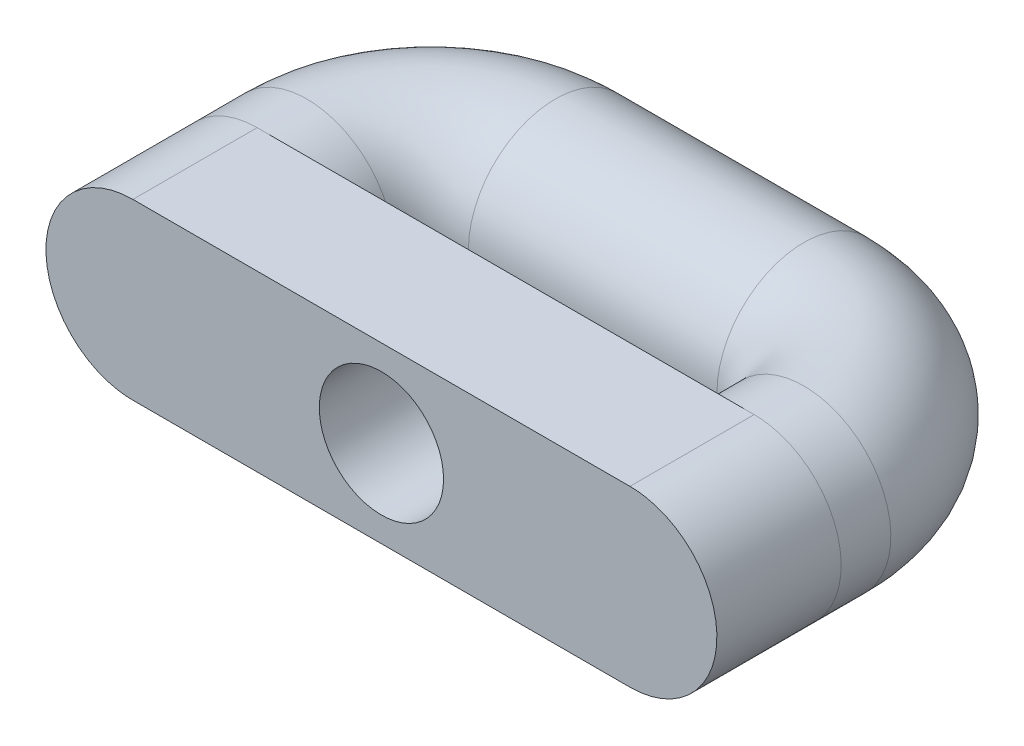
ISO-10303-21;
HEADER;
FILE_DESCRIPTION(('STEP AP214'),'2;1');
FILE_NAME('part.step','',(''),(''),'','','');
FILE_SCHEMA(('AUTOMOTIVE_DESIGN { 1 0 10303 214 1 1 1 1 }'));
ENDSEC;
DATA;
#1=APPLICATION_CONTEXT('core data for automotive mechanical design processes');
#2=APPLICATION_PROTOCOL_DEFINITION('international standard','automotive_design',2000,#1);
#3=PRODUCT_CONTEXT('',#1,'mechanical');
#4=PRODUCT('Part','Part','',(#3));
#5=PRODUCT_RELATED_PRODUCT_CATEGORY('part','',(#4));
#6=PRODUCT_DEFINITION_FORMATION('','',#4);
#7=PRODUCT_DEFINITION_CONTEXT('part definition',#1,'design');
#8=PRODUCT_DEFINITION('design','',#6,#7);
#9=PRODUCT_DEFINITION_SHAPE('','',#8);
#10=(LENGTH_UNIT() NAMED_UNIT(*) SI_UNIT(.MILLI.,.METRE.));
#11=(NAMED_UNIT(*) PLANE_ANGLE_UNIT() SI_UNIT($,.RADIAN.));
#12=(NAMED_UNIT(*) SI_UNIT($,.STERADIAN.) SOLID_ANGLE_UNIT());
#13=UNCERTAINTY_MEASURE_WITH_UNIT(LENGTH_MEASURE(1.E-05),#10,'distance_accuracy_value','');
#14=(GEOMETRIC_REPRESENTATION_CONTEXT(3) GLOBAL_UNCERTAINTY_ASSIGNED_CONTEXT((#13)) GLOBAL_UNIT_ASSIGNED_CONTEXT((#10,
#11,#12)) REPRESENTATION_CONTEXT('',''));
#15=CARTESIAN_POINT('',(0.,0.,0.));
#16=DIRECTION('',(0.,0.,1.));
#17=DIRECTION('',(1.,0.,0.));
#18=AXIS2_PLACEMENT_3D('',#15,#16,#17);
#19=CARTESIAN_POINT('',(0.,0.,0.));
#20=DIRECTION('',(0.,0.,1.));
#21=DIRECTION('',(1.,0.,0.));
#22=AXIS2_PLACEMENT_3D('',#19,#20,#21);
#23=PLANE('',#22);
#24=CARTESIAN_POINT('',(12.7,0.,0.));
#25=DIRECTION('',(0.,0.,1.));
#26=DIRECTION('',(1.,0.,0.));
#27=AXIS2_PLACEMENT_3D('',#24,#25,#26);
#28=CIRCLE('',#27,3.175);
#29=CARTESIAN_POINT('',(15.875,0.,0.));
#30=VERTEX_POINT('',#29);
#31=EDGE_CURVE('E135',#30,#30,#28,.F.);
#32=ORIENTED_EDGE('',*,*,#31,.F.);
#33=EDGE_LOOP('',(#32));
#34=FACE_BOUND('',#33,.T.);
#35=CARTESIAN_POINT('',(0.,0.,0.));
#36=DIRECTION('',(0.,0.,-1.));
#37=DIRECTION('',(0.,-1.,0.));
#38=AXIS2_PLACEMENT_3D('',#35,#36,#37);
#39=ELLIPSE('',#38,4.445,4.445);
#40=CARTESIAN_POINT('',(0.,4.445,0.));
#41=VERTEX_POINT('',#40);
#42=CARTESIAN_POINT('',(0.,-4.445,0.));
#43=VERTEX_POINT('',#42);
#44=EDGE_CURVE('E11',#41,#43,#39,.T.);
#45=ORIENTED_EDGE('',*,*,#44,.F.);
#46=DIRECTION('',(1.,0.,0.));
#47=VECTOR('',#46,1.);
#48=CARTESIAN_POINT('',(0.,4.445,0.));
#49=LINE('',#48,#47);
#50=CARTESIAN_POINT('',(25.4,4.445,0.));
#51=VERTEX_POINT('',#50);
#52=EDGE_CURVE('E136',#41,#51,#49,.T.);
#53=ORIENTED_EDGE('',*,*,#52,.T.);
#54=CARTESIAN_POINT('',(25.4,0.,0.));
#55=DIRECTION('',(0.,0.,1.));
#56=DIRECTION('',(1.,0.,0.));
#57=AXIS2_PLACEMENT_3D('',#54,#55,#56);
#58=CIRCLE('',#57,4.445);
#59=CARTESIAN_POINT('',(25.4,-4.445,0.));
#60=VERTEX_POINT('',#59);
#61=EDGE_CURVE('E21',#51,#60,#58,.T.);
#62=ORIENTED_EDGE('',*,*,#61,.T.);
#63=DIRECTION('',(1.,0.,0.));
#64=VECTOR('',#63,1.);
#65=CARTESIAN_POINT('',(0.,-4.445,0.));
#66=LINE('',#65,#64);
#67=EDGE_CURVE('E70',#43,#60,#66,.T.);
#68=ORIENTED_EDGE('',*,*,#67,.F.);
#69=EDGE_LOOP('',(#45,#53,#62,#68));
#70=FACE_BOUND('',#69,.T.);
#71=ADVANCED_FACE('F17',(#34,#70),#23,.F.);
#72=CARTESIAN_POINT('',(0.,-4.445,6.35));
#73=DIRECTION('',(0.,1.,0.));
#74=DIRECTION('',(0.,0.,1.));
#75=AXIS2_PLACEMENT_3D('',#72,#73,#74);
#76=PLANE('',#75);
#77=ORIENTED_EDGE('',*,*,#67,.T.);
#78=DIRECTION('',(0.,0.,-1.));
#79=VECTOR('',#78,1.);
#80=CARTESIAN_POINT('',(25.4,-4.445,6.35));
#81=LINE('',#80,#79);
#82=CARTESIAN_POINT('',(25.4,-4.445,6.35));
#83=VERTEX_POINT('',#82);
#84=EDGE_CURVE('E95',#83,#60,#81,.T.);
#85=ORIENTED_EDGE('',*,*,#84,.F.);
#86=DIRECTION('',(1.,0.,0.));
#87=VECTOR('',#86,1.);
#88=CARTESIAN_POINT('',(0.,-4.445,6.35));
#89=LINE('',#88,#87);
#90=CARTESIAN_POINT('',(0.,-4.445,6.35));
#91=VERTEX_POINT('',#90);
#92=EDGE_CURVE('E84',#91,#83,#89,.T.);
#93=ORIENTED_EDGE('',*,*,#92,.F.);
#94=DIRECTION('',(0.,0.,-1.));
#95=VECTOR('',#94,1.);
#96=CARTESIAN_POINT('',(0.,-4.445,6.35));
#97=LINE('',#96,#95);
#98=EDGE_CURVE('E108',#91,#43,#97,.T.);
#99=ORIENTED_EDGE('',*,*,#98,.T.);
#100=EDGE_LOOP('',(#77,#85,#93,#99));
#101=FACE_BOUND('',#100,.T.);
#102=ADVANCED_FACE('F19',(#101),#76,.F.);
#103=CARTESIAN_POINT('',(25.4,0.,6.35));
#104=DIRECTION('',(0.,0.,1.));
#105=DIRECTION('',(0.,-1.,0.));
#106=AXIS2_PLACEMENT_3D('',#103,#104,#105);
#107=ELLIPSE('',#106,4.445,4.445);
#108=DIRECTION('',(0.,0.,-1.));
#109=VECTOR('',#108,1.);
#110=SURFACE_OF_LINEAR_EXTRUSION('',#107,#109);
#111=ORIENTED_EDGE('',*,*,#84,.T.);
#112=CARTESIAN_POINT('',(25.4,0.,0.));
#113=DIRECTION('',(0.,0.,1.));
#114=DIRECTION('',(0.,-1.,0.));
#115=AXIS2_PLACEMENT_3D('',#112,#113,#114);
#116=ELLIPSE('',#115,4.445,4.445);
#117=EDGE_CURVE('E92',#60,#51,#116,.T.);
#118=ORIENTED_EDGE('',*,*,#117,.T.);
#119=DIRECTION('',(0.,0.,-1.));
#120=VECTOR('',#119,1.);
#121=CARTESIAN_POINT('',(25.4,4.445,6.35));
#122=LINE('',#121,#120);
#123=CARTESIAN_POINT('',(25.4,4.445,6.35));
#124=VERTEX_POINT('',#123);
#125=EDGE_CURVE('E58',#124,#51,#122,.T.);
#126=ORIENTED_EDGE('',*,*,#125,.F.);
#127=EDGE_CURVE('E80',#83,#124,#107,.T.);
#128=ORIENTED_EDGE('',*,*,#127,.F.);
#129=EDGE_LOOP('',(#111,#118,#126,#128));
#130=FACE_BOUND('',#129,.T.);
#131=ADVANCED_FACE('F90',(#130),#110,.F.);
#132=CARTESIAN_POINT('',(0.,4.445,6.35));
#133=DIRECTION('',(0.,1.,0.));
#134=DIRECTION('',(0.,0.,1.));
#135=AXIS2_PLACEMENT_3D('',#132,#133,#134);
#136=PLANE('',#135);
#137=ORIENTED_EDGE('',*,*,#52,.F.);
#138=DIRECTION('',(0.,0.,-1.));
#139=VECTOR('',#138,1.);
#140=CARTESIAN_POINT('',(0.,4.445,6.35));
#141=LINE('',#140,#139);
#142=CARTESIAN_POINT('',(0.,4.445,6.35));
#143=VERTEX_POINT('',#142);
#144=EDGE_CURVE('E96',#143,#41,#141,.T.);
#145=ORIENTED_EDGE('',*,*,#144,.F.);
#146=DIRECTION('',(1.,0.,0.));
#147=VECTOR('',#146,1.);
#148=CARTESIAN_POINT('',(0.,4.445,6.35));
#149=LINE('',#148,#147);
#150=EDGE_CURVE('E82',#143,#124,#149,.T.);
#151=ORIENTED_EDGE('',*,*,#150,.T.);
#152=ORIENTED_EDGE('',*,*,#125,.T.);
#153=EDGE_LOOP('',(#137,#145,#151,#152));
#154=FACE_BOUND('',#153,.T.);
#155=ADVANCED_FACE('F98',(#154),#136,.T.);
#156=CARTESIAN_POINT('',(0.,0.,6.35));
#157=DIRECTION('',(0.,0.,1.));
#158=DIRECTION('',(0.,-1.,0.));
#159=AXIS2_PLACEMENT_3D('',#156,#157,#158);
#160=ELLIPSE('',#159,4.445,4.445);
#161=DIRECTION('',(0.,0.,-1.));
#162=VECTOR('',#161,1.);
#163=SURFACE_OF_LINEAR_EXTRUSION('',#160,#162);
#164=CARTESIAN_POINT('',(0.,0.,0.));
#165=DIRECTION('',(0.,0.,1.));
#166=DIRECTION('',(0.,-1.,0.));
#167=AXIS2_PLACEMENT_3D('',#164,#165,#166);
#168=ELLIPSE('',#167,4.445,4.445);
#169=EDGE_CURVE('E140',#41,#43,#168,.T.);
#170=ORIENTED_EDGE('',*,*,#169,.T.);
#171=ORIENTED_EDGE('',*,*,#98,.F.);
#172=EDGE_CURVE('E41',#143,#91,#160,.T.);
#173=ORIENTED_EDGE('',*,*,#172,.F.);
#174=ORIENTED_EDGE('',*,*,#144,.T.);
#175=EDGE_LOOP('',(#170,#171,#173,#174));
#176=FACE_BOUND('',#175,.T.);
#177=ADVANCED_FACE('F116',(#176),#163,.F.);
#178=CARTESIAN_POINT('',(0.,0.,6.35));
#179=DIRECTION('',(0.,0.,1.));
#180=DIRECTION('',(1.,0.,0.));
#181=AXIS2_PLACEMENT_3D('',#178,#179,#180);
#182=PLANE('',#181);
#183=CARTESIAN_POINT('',(12.7,0.,6.35));
#184=DIRECTION('',(0.,0.,1.));
#185=DIRECTION('',(1.,0.,0.));
#186=AXIS2_PLACEMENT_3D('',#183,#184,#185);
#187=CIRCLE('',#186,3.175);
#188=CARTESIAN_POINT('',(15.875,0.,6.35));
#189=VERTEX_POINT('',#188);
#190=EDGE_CURVE('E184',#189,#189,#187,.T.);
#191=ORIENTED_EDGE('',*,*,#190,.F.);
#192=EDGE_LOOP('',(#191));
#193=FACE_BOUND('',#192,.T.);
#194=ORIENTED_EDGE('',*,*,#92,.T.);
#195=ORIENTED_EDGE('',*,*,#127,.T.);
#196=ORIENTED_EDGE('',*,*,#150,.F.);
#197=ORIENTED_EDGE('',*,*,#172,.T.);
#198=EDGE_LOOP('',(#194,#195,#196,#197));
#199=FACE_BOUND('',#198,.T.);
#200=ADVANCED_FACE('F81',(#193,#199),#182,.T.);
#201=CARTESIAN_POINT('',(25.4,0.,-2.54));
#202=DIRECTION('',(0.,0.,1.));
#203=DIRECTION('',(1.,0.,0.));
#204=AXIS2_PLACEMENT_3D('',#201,#202,#203);
#205=CYLINDRICAL_SURFACE('',#204,4.445);
#206=CARTESIAN_POINT('',(25.4,0.,-2.54));
#207=DIRECTION('',(0.,0.,1.));
#208=DIRECTION('',(0.,-1.,0.));
#209=AXIS2_PLACEMENT_3D('',#206,#207,#208);
#210=ELLIPSE('',#209,4.445,4.445);
#211=CARTESIAN_POINT('',(25.4,-4.445,-2.54));
#212=VERTEX_POINT('',#211);
#213=EDGE_CURVE('E163',#212,#212,#210,.T.);
#214=ORIENTED_EDGE('',*,*,#213,.T.);
#215=EDGE_LOOP('',(#214));
#216=FACE_BOUND('',#215,.T.);
#217=ORIENTED_EDGE('',*,*,#61,.F.);
#218=ORIENTED_EDGE('',*,*,#117,.F.);
#219=EDGE_LOOP('',(#217,#218));
#220=FACE_BOUND('',#219,.T.);
#221=ADVANCED_FACE('F201',(#216,#220),#205,.T.);
#222=CARTESIAN_POINT('',(0.,0.,0.));
#223=DIRECTION('',(0.,0.,-1.));
#224=DIRECTION('',(-1.,0.,0.));
#225=AXIS2_PLACEMENT_3D('',#222,#223,#224);
#226=CYLINDRICAL_SURFACE('',#225,4.445);
#227=CARTESIAN_POINT('',(0.,0.,-2.53999999999995));
#228=DIRECTION('',(0.,0.,-1.));
#229=DIRECTION('',(0.,-1.,0.));
#230=AXIS2_PLACEMENT_3D('',#227,#228,#229);
#231=ELLIPSE('',#230,4.445,4.445);
#232=CARTESIAN_POINT('',(0.,-4.445,-2.53999999999995));
#233=VERTEX_POINT('',#232);
#234=EDGE_CURVE('E181',#233,#233,#231,.T.);
#235=ORIENTED_EDGE('',*,*,#234,.F.);
#236=EDGE_LOOP('',(#235));
#237=FACE_BOUND('',#236,.T.);
#238=ORIENTED_EDGE('',*,*,#169,.F.);
#239=ORIENTED_EDGE('',*,*,#44,.T.);
#240=EDGE_LOOP('',(#238,#239));
#241=FACE_BOUND('',#240,.T.);
#242=ADVANCED_FACE('F145',(#237,#241),#226,.T.);
#243=CARTESIAN_POINT('',(6.35,0.,-2.54));
#244=DIRECTION('',(0.,-1.,0.));
#245=DIRECTION('',(0.,0.,-1.));
#246=AXIS2_PLACEMENT_3D('',#243,#244,#245);
#247=TOROIDAL_SURFACE('',#246,6.35,4.445);
#248=CARTESIAN_POINT('',(6.35,0.,-8.89));
#249=DIRECTION('',(1.,0.,0.));
#250=DIRECTION('',(0.,-1.,0.));
#251=AXIS2_PLACEMENT_3D('',#248,#249,#250);
#252=ELLIPSE('',#251,4.445,4.445);
#253=CARTESIAN_POINT('',(6.35,-4.445,-8.89));
#254=VERTEX_POINT('',#253);
#255=EDGE_CURVE('E176',#254,#254,#252,.T.);
#256=ORIENTED_EDGE('',*,*,#255,.F.);
#257=EDGE_LOOP('',(#256));
#258=FACE_BOUND('',#257,.T.);
#259=ORIENTED_EDGE('',*,*,#234,.T.);
#260=EDGE_LOOP('',(#259));
#261=FACE_BOUND('',#260,.T.);
#262=ADVANCED_FACE('F213',(#258,#261),#247,.T.);
#263=CARTESIAN_POINT('',(6.35,0.,-8.89));
#264=DIRECTION('',(1.,0.,0.));
#265=DIRECTION('',(0.,0.,-1.));
#266=AXIS2_PLACEMENT_3D('',#263,#264,#265);
#267=CYLINDRICAL_SURFACE('',#266,4.445);
#268=CARTESIAN_POINT('',(19.05,0.,-8.89));
#269=DIRECTION('',(1.,0.,0.));
#270=DIRECTION('',(0.,-1.,0.));
#271=AXIS2_PLACEMENT_3D('',#268,#269,#270);
#272=ELLIPSE('',#271,4.445,4.445);
#273=CARTESIAN_POINT('',(19.05,-4.445,-8.89));
#274=VERTEX_POINT('',#273);
#275=EDGE_CURVE('E168',#274,#274,#272,.T.);
#276=ORIENTED_EDGE('',*,*,#275,.F.);
#277=EDGE_LOOP('',(#276));
#278=FACE_BOUND('',#277,.T.);
#279=ORIENTED_EDGE('',*,*,#255,.T.);
#280=EDGE_LOOP('',(#279));
#281=FACE_BOUND('',#280,.T.);
#282=ADVANCED_FACE('F209',(#278,#281),#267,.T.);
#283=CARTESIAN_POINT('',(19.05,0.,-2.54));
#284=DIRECTION('',(0.,-1.,0.));
#285=DIRECTION('',(0.,0.,-1.));
#286=AXIS2_PLACEMENT_3D('',#283,#284,#285);
#287=TOROIDAL_SURFACE('',#286,6.35,4.445);
#288=ORIENTED_EDGE('',*,*,#213,.F.);
#289=EDGE_LOOP('',(#288));
#290=FACE_BOUND('',#289,.T.);
#291=ORIENTED_EDGE('',*,*,#275,.T.);
#292=EDGE_LOOP('',(#291));
#293=FACE_BOUND('',#292,.T.);
#294=ADVANCED_FACE('F196',(#290,#293),#287,.T.);
#295=CARTESIAN_POINT('',(12.7,0.,-8.98025612106916));
#296=DIRECTION('',(0.,0.,1.));
#297=DIRECTION('',(1.,0.,0.));
#298=AXIS2_PLACEMENT_3D('',#295,#296,#297);
#299=CYLINDRICAL_SURFACE('',#298,3.175);
#300=CARTESIAN_POINT('',(15.875,0.,0.));
#301=CARTESIAN_POINT('',(15.875,0.,0.0661458333333318));
#302=CARTESIAN_POINT('',(15.875,0.,0.132291666666665));
#303=CARTESIAN_POINT('',(15.875,0.,0.264583333333332));
#304=CARTESIAN_POINT('',(15.875,0.,0.330729166666665));
#305=CARTESIAN_POINT('',(15.875,0.,0.463020833333331));
#306=CARTESIAN_POINT('',(15.875,0.,0.529166666666665));
#307=CARTESIAN_POINT('',(15.875,0.,0.661458333333332));
#308=CARTESIAN_POINT('',(15.875,0.,0.727604166666665));
#309=CARTESIAN_POINT('',(15.875,0.,0.859895833333331));
#310=CARTESIAN_POINT('',(15.875,0.,0.926041666666665));
#311=CARTESIAN_POINT('',(15.875,0.,1.05833333333333));
#312=CARTESIAN_POINT('',(15.875,0.,1.12447916666667));
#313=CARTESIAN_POINT('',(15.875,0.,1.25677083333333));
#314=CARTESIAN_POINT('',(15.875,0.,1.32291666666666));
#315=CARTESIAN_POINT('',(15.875,0.,1.45520833333333));
#316=CARTESIAN_POINT('',(15.875,0.,1.52135416666667));
#317=CARTESIAN_POINT('',(15.875,0.,1.65364583333333));
#318=CARTESIAN_POINT('',(15.875,0.,1.71979166666667));
#319=CARTESIAN_POINT('',(15.875,0.,1.85208333333333));
#320=CARTESIAN_POINT('',(15.875,0.,1.91822916666667));
#321=CARTESIAN_POINT('',(15.875,0.,2.05052083333333));
#322=CARTESIAN_POINT('',(15.875,0.,2.11666666666667));
#323=CARTESIAN_POINT('',(15.875,0.,2.24895833333333));
#324=CARTESIAN_POINT('',(15.875,0.,2.31510416666667));
#325=CARTESIAN_POINT('',(15.875,0.,2.44739583333333));
#326=CARTESIAN_POINT('',(15.875,0.,2.51354166666667));
#327=CARTESIAN_POINT('',(15.875,0.,2.64583333333333));
#328=CARTESIAN_POINT('',(15.875,0.,2.71197916666667));
#329=CARTESIAN_POINT('',(15.875,0.,2.84427083333333));
#330=CARTESIAN_POINT('',(15.875,0.,2.91041666666667));
#331=CARTESIAN_POINT('',(15.875,0.,3.04270833333333));
#332=CARTESIAN_POINT('',(15.875,0.,3.10885416666667));
#333=CARTESIAN_POINT('',(15.875,0.,3.24114583333333));
#334=CARTESIAN_POINT('',(15.875,0.,3.30729166666667));
#335=CARTESIAN_POINT('',(15.875,0.,3.43958333333333));
#336=CARTESIAN_POINT('',(15.875,0.,3.50572916666667));
#337=CARTESIAN_POINT('',(15.875,0.,3.63802083333333));
#338=CARTESIAN_POINT('',(15.875,0.,3.70416666666667));
#339=CARTESIAN_POINT('',(15.875,0.,3.83645833333333));
#340=CARTESIAN_POINT('',(15.875,0.,3.90260416666667));
#341=CARTESIAN_POINT('',(15.875,0.,4.03489583333333));
#342=CARTESIAN_POINT('',(15.875,0.,4.10104166666667));
#343=CARTESIAN_POINT('',(15.875,0.,4.23333333333333));
#344=CARTESIAN_POINT('',(15.875,0.,4.29947916666667));
#345=CARTESIAN_POINT('',(15.875,0.,4.43177083333333));
#346=CARTESIAN_POINT('',(15.875,0.,4.49791666666667));
#347=CARTESIAN_POINT('',(15.875,0.,4.63020833333333));
#348=CARTESIAN_POINT('',(15.875,0.,4.69635416666667));
#349=CARTESIAN_POINT('',(15.875,0.,4.82864583333333));
#350=CARTESIAN_POINT('',(15.875,0.,4.89479166666667));
#351=CARTESIAN_POINT('',(15.875,0.,5.02708333333333));
#352=CARTESIAN_POINT('',(15.875,0.,5.09322916666667));
#353=CARTESIAN_POINT('',(15.875,0.,5.22552083333333));
#354=CARTESIAN_POINT('',(15.875,0.,5.29166666666667));
#355=CARTESIAN_POINT('',(15.875,0.,5.42395833333333));
#356=CARTESIAN_POINT('',(15.875,0.,5.49010416666667));
#357=CARTESIAN_POINT('',(15.875,0.,5.62239583333333));
#358=CARTESIAN_POINT('',(15.875,0.,5.68854166666667));
#359=CARTESIAN_POINT('',(15.875,0.,5.82083333333333));
#360=CARTESIAN_POINT('',(15.875,0.,5.88697916666667));
#361=CARTESIAN_POINT('',(15.875,0.,6.01927083333333));
#362=CARTESIAN_POINT('',(15.875,0.,6.08541666666667));
#363=CARTESIAN_POINT('',(15.875,0.,6.21770833333333));
#364=CARTESIAN_POINT('',(15.875,0.,6.28385416666667));
#365=CARTESIAN_POINT('',(15.875,0.,6.35));
#366=B_SPLINE_CURVE_WITH_KNOTS('',3,(#300,#301,#302,#303,#304,#305,#306,#307,#308,#309,#310,
#311,#312,#313,#314,#315,#316,#317,#318,#319,#320,#321,#322,#323,#324,#325,#326,#327,#328,#329,
#330,#331,#332,#333,#334,#335,#336,#337,#338,#339,#340,#341,#342,#343,#344,#345,#346,#347,#348,
#349,#350,#351,#352,#353,#354,#355,#356,#357,#358,#359,#360,#361,#362,#363,#364,#365),
.UNSPECIFIED.,.F.,.F.,(4,2,2,2,2,2,2,2,2,2,2,2,2,2,2,2,2,2,2,2,2,2,2,2,2,2,2,2,2,2,2,2,4),(0.,
0.198437500000001,0.396875,0.5953125,0.793749999999999,0.9921875,1.190625,1.3890625,1.5875,
1.7859375,1.984375,2.1828125,2.38125,2.5796875,2.778125,2.9765625,3.175,3.3734375,3.571875,
3.7703125,3.96875,4.1671875,4.365625,4.5640625,4.7625,4.9609375,5.159375,5.3578125,5.55625,
5.7546875,5.953125,6.1515625,6.35),.UNSPECIFIED.);
#367=EDGE_CURVE('BSEAM193',#30,#189,#366,.T.);
#368=ORIENTED_EDGE('',*,*,#31,.T.);
#369=ORIENTED_EDGE('',*,*,#190,.T.);
#370=ORIENTED_EDGE('',*,*,#367,.T.);
#371=ORIENTED_EDGE('',*,*,#367,.F.);
#372=EDGE_LOOP('',(#368,#370,#369,#371));
#373=FACE_BOUND('',#372,.T.);
#374=ADVANCED_FACE('F193',(#373),#299,.F.);
#375=CLOSED_SHELL('',(#71,#102,#131,#155,#177,#200,#221,#242,#262,#282,#294,#374));
#376=MANIFOLD_SOLID_BREP('B1',#375);
#377=ADVANCED_BREP_SHAPE_REPRESENTATION('',(#18,#376),#14);
#378=SHAPE_DEFINITION_REPRESENTATION(#9,#377);
ENDSEC;
END-ISO-10303-21;
